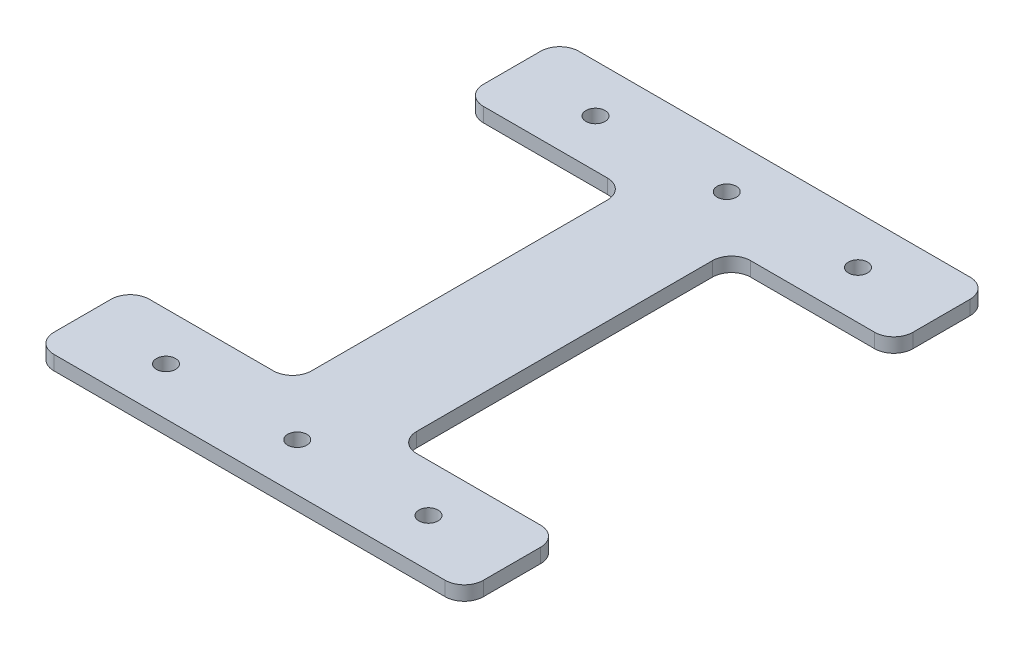
ISO-10303-21;
HEADER;
FILE_DESCRIPTION(('STEP AP214'),'2;1');
FILE_NAME('part.step','',(''),(''),'','','');
FILE_SCHEMA(('AUTOMOTIVE_DESIGN { 1 0 10303 214 1 1 1 1 }'));
ENDSEC;
DATA;
#1=APPLICATION_CONTEXT('core data for automotive mechanical design processes');
#2=APPLICATION_PROTOCOL_DEFINITION('international standard','automotive_design',2000,#1);
#3=PRODUCT_CONTEXT('',#1,'mechanical');
#4=PRODUCT('Part','Part','',(#3));
#5=PRODUCT_RELATED_PRODUCT_CATEGORY('part','',(#4));
#6=PRODUCT_DEFINITION_FORMATION('','',#4);
#7=PRODUCT_DEFINITION_CONTEXT('part definition',#1,'design');
#8=PRODUCT_DEFINITION('design','',#6,#7);
#9=PRODUCT_DEFINITION_SHAPE('','',#8);
#10=(LENGTH_UNIT() NAMED_UNIT(*) SI_UNIT(.MILLI.,.METRE.));
#11=(NAMED_UNIT(*) PLANE_ANGLE_UNIT() SI_UNIT($,.RADIAN.));
#12=(NAMED_UNIT(*) SI_UNIT($,.STERADIAN.) SOLID_ANGLE_UNIT());
#13=UNCERTAINTY_MEASURE_WITH_UNIT(LENGTH_MEASURE(1.E-05),#10,'distance_accuracy_value','');
#14=(GEOMETRIC_REPRESENTATION_CONTEXT(3) GLOBAL_UNCERTAINTY_ASSIGNED_CONTEXT((#13)) GLOBAL_UNIT_ASSIGNED_CONTEXT((#10,
#11,#12)) REPRESENTATION_CONTEXT('',''));
#15=CARTESIAN_POINT('',(0.,0.,0.));
#16=DIRECTION('',(0.,0.,1.));
#17=DIRECTION('',(1.,0.,0.));
#18=AXIS2_PLACEMENT_3D('',#15,#16,#17);
#19=CARTESIAN_POINT('',(11.,3.,0.));
#20=DIRECTION('',(1.,0.,0.));
#21=DIRECTION('',(0.,0.,-1.));
#22=AXIS2_PLACEMENT_3D('',#19,#20,#21);
#23=PLANE('',#22);
#24=DIRECTION('',(0.,0.,1.));
#25=VECTOR('',#24,1.);
#26=CARTESIAN_POINT('',(11.,3.,0.));
#27=LINE('',#26,#25);
#28=CARTESIAN_POINT('',(11.,3.,-31.));
#29=VERTEX_POINT('',#28);
#30=CARTESIAN_POINT('',(11.,3.,31.));
#31=VERTEX_POINT('',#30);
#32=EDGE_CURVE('E254',#29,#31,#27,.T.);
#33=ORIENTED_EDGE('',*,*,#32,.T.);
#34=DIRECTION('',(0.,-1.,0.));
#35=VECTOR('',#34,1.);
#36=CARTESIAN_POINT('',(11.,0.,31.));
#37=LINE('',#36,#35);
#38=CARTESIAN_POINT('',(11.,0.,31.));
#39=VERTEX_POINT('',#38);
#40=EDGE_CURVE('E289',#31,#39,#37,.T.);
#41=ORIENTED_EDGE('',*,*,#40,.T.);
#42=DIRECTION('',(0.,0.,1.));
#43=VECTOR('',#42,1.);
#44=CARTESIAN_POINT('',(11.,0.,0.));
#45=LINE('',#44,#43);
#46=CARTESIAN_POINT('',(11.,0.,-31.));
#47=VERTEX_POINT('',#46);
#48=EDGE_CURVE('E350',#47,#39,#45,.T.);
#49=ORIENTED_EDGE('',*,*,#48,.F.);
#50=DIRECTION('',(0.,-1.,0.));
#51=VECTOR('',#50,1.);
#52=CARTESIAN_POINT('',(11.,3.,-31.));
#53=LINE('',#52,#51);
#54=EDGE_CURVE('E287',#47,#29,#53,.F.);
#55=ORIENTED_EDGE('',*,*,#54,.T.);
#56=EDGE_LOOP('',(#33,#41,#49,#55));
#57=FACE_BOUND('',#56,.T.);
#58=ADVANCED_FACE('F39',(#57),#23,.T.);
#59=CARTESIAN_POINT('',(0.,3.,-35.));
#60=DIRECTION('',(0.,0.,-1.));
#61=DIRECTION('',(-1.,0.,0.));
#62=AXIS2_PLACEMENT_3D('',#59,#60,#61);
#63=PLANE('',#62);
#64=DIRECTION('',(1.,0.,0.));
#65=VECTOR('',#64,1.);
#66=CARTESIAN_POINT('',(0.,3.,-35.));
#67=LINE('',#66,#65);
#68=CARTESIAN_POINT('',(15.,3.,-35.));
#69=VERTEX_POINT('',#68);
#70=CARTESIAN_POINT('',(41.,3.,-35.));
#71=VERTEX_POINT('',#70);
#72=EDGE_CURVE('E368',#69,#71,#67,.T.);
#73=ORIENTED_EDGE('',*,*,#72,.F.);
#74=DIRECTION('',(0.,-1.,0.));
#75=VECTOR('',#74,1.);
#76=CARTESIAN_POINT('',(15.,3.,-35.));
#77=LINE('',#76,#75);
#78=CARTESIAN_POINT('',(15.,0.,-35.));
#79=VERTEX_POINT('',#78);
#80=EDGE_CURVE('E318',#69,#79,#77,.T.);
#81=ORIENTED_EDGE('',*,*,#80,.T.);
#82=DIRECTION('',(1.,0.,0.));
#83=VECTOR('',#82,1.);
#84=CARTESIAN_POINT('',(0.,0.,-35.));
#85=LINE('',#84,#83);
#86=CARTESIAN_POINT('',(41.,0.,-35.));
#87=VERTEX_POINT('',#86);
#88=EDGE_CURVE('E352',#79,#87,#85,.T.);
#89=ORIENTED_EDGE('',*,*,#88,.T.);
#90=DIRECTION('',(0.,-1.,0.));
#91=VECTOR('',#90,1.);
#92=CARTESIAN_POINT('',(41.,3.,-35.));
#93=LINE('',#92,#91);
#94=EDGE_CURVE('E316',#87,#71,#93,.F.);
#95=ORIENTED_EDGE('',*,*,#94,.T.);
#96=EDGE_LOOP('',(#73,#81,#89,#95));
#97=FACE_BOUND('',#96,.T.);
#98=ADVANCED_FACE('F371',(#97),#63,.F.);
#99=CARTESIAN_POINT('',(45.,3.,0.));
#100=DIRECTION('',(1.,0.,0.));
#101=DIRECTION('',(0.,0.,-1.));
#102=AXIS2_PLACEMENT_3D('',#99,#100,#101);
#103=PLANE('',#102);
#104=DIRECTION('',(0.,0.,1.));
#105=VECTOR('',#104,1.);
#106=CARTESIAN_POINT('',(45.,3.,0.));
#107=LINE('',#106,#105);
#108=CARTESIAN_POINT('',(45.,3.,-51.));
#109=VERTEX_POINT('',#108);
#110=CARTESIAN_POINT('',(45.,3.,-39.));
#111=VERTEX_POINT('',#110);
#112=EDGE_CURVE('E373',#109,#111,#107,.T.);
#113=ORIENTED_EDGE('',*,*,#112,.T.);
#114=DIRECTION('',(0.,-1.,0.));
#115=VECTOR('',#114,1.);
#116=CARTESIAN_POINT('',(45.,0.,-39.));
#117=LINE('',#116,#115);
#118=CARTESIAN_POINT('',(45.,0.,-39.));
#119=VERTEX_POINT('',#118);
#120=EDGE_CURVE('E323',#111,#119,#117,.T.);
#121=ORIENTED_EDGE('',*,*,#120,.T.);
#122=DIRECTION('',(0.,0.,1.));
#123=VECTOR('',#122,1.);
#124=CARTESIAN_POINT('',(45.,0.,0.));
#125=LINE('',#124,#123);
#126=CARTESIAN_POINT('',(45.,0.,-51.));
#127=VERTEX_POINT('',#126);
#128=EDGE_CURVE('E421',#127,#119,#125,.T.);
#129=ORIENTED_EDGE('',*,*,#128,.F.);
#130=DIRECTION('',(0.,-1.,0.));
#131=VECTOR('',#130,1.);
#132=CARTESIAN_POINT('',(45.,3.,-51.));
#133=LINE('',#132,#131);
#134=EDGE_CURVE('E321',#127,#109,#133,.F.);
#135=ORIENTED_EDGE('',*,*,#134,.T.);
#136=EDGE_LOOP('',(#113,#121,#129,#135));
#137=FACE_BOUND('',#136,.T.);
#138=ADVANCED_FACE('F464',(#137),#103,.T.);
#139=CARTESIAN_POINT('',(0.,3.,-55.));
#140=DIRECTION('',(0.,0.,-1.));
#141=DIRECTION('',(-1.,0.,0.));
#142=AXIS2_PLACEMENT_3D('',#139,#140,#141);
#143=PLANE('',#142);
#144=DIRECTION('',(1.,0.,0.));
#145=VECTOR('',#144,1.);
#146=CARTESIAN_POINT('',(0.,3.,-55.));
#147=LINE('',#146,#145);
#148=CARTESIAN_POINT('',(-41.,3.,-55.));
#149=VERTEX_POINT('',#148);
#150=CARTESIAN_POINT('',(41.,3.,-55.));
#151=VERTEX_POINT('',#150);
#152=EDGE_CURVE('E377',#149,#151,#147,.T.);
#153=ORIENTED_EDGE('',*,*,#152,.T.);
#154=DIRECTION('',(0.,-1.,0.));
#155=VECTOR('',#154,1.);
#156=CARTESIAN_POINT('',(41.,3.,-55.));
#157=LINE('',#156,#155);
#158=CARTESIAN_POINT('',(41.,0.,-55.));
#159=VERTEX_POINT('',#158);
#160=EDGE_CURVE('E328',#151,#159,#157,.T.);
#161=ORIENTED_EDGE('',*,*,#160,.T.);
#162=DIRECTION('',(1.,0.,0.));
#163=VECTOR('',#162,1.);
#164=CARTESIAN_POINT('',(0.,0.,-55.));
#165=LINE('',#164,#163);
#166=CARTESIAN_POINT('',(-41.,0.,-55.));
#167=VERTEX_POINT('',#166);
#168=EDGE_CURVE('E425',#167,#159,#165,.T.);
#169=ORIENTED_EDGE('',*,*,#168,.F.);
#170=DIRECTION('',(0.,-1.,0.));
#171=VECTOR('',#170,1.);
#172=CARTESIAN_POINT('',(-41.,3.,-55.));
#173=LINE('',#172,#171);
#174=EDGE_CURVE('E326',#167,#149,#173,.F.);
#175=ORIENTED_EDGE('',*,*,#174,.T.);
#176=EDGE_LOOP('',(#153,#161,#169,#175));
#177=FACE_BOUND('',#176,.T.);
#178=ADVANCED_FACE('F538',(#177),#143,.T.);
#179=CARTESIAN_POINT('',(-45.,3.,0.));
#180=DIRECTION('',(1.,0.,0.));
#181=DIRECTION('',(0.,0.,-1.));
#182=AXIS2_PLACEMENT_3D('',#179,#180,#181);
#183=PLANE('',#182);
#184=DIRECTION('',(0.,0.,1.));
#185=VECTOR('',#184,1.);
#186=CARTESIAN_POINT('',(-45.,3.,0.));
#187=LINE('',#186,#185);
#188=CARTESIAN_POINT('',(-45.,3.,-51.));
#189=VERTEX_POINT('',#188);
#190=CARTESIAN_POINT('',(-45.,3.,-39.));
#191=VERTEX_POINT('',#190);
#192=EDGE_CURVE('E382',#189,#191,#187,.T.);
#193=ORIENTED_EDGE('',*,*,#192,.F.);
#194=DIRECTION('',(0.,-1.,0.));
#195=VECTOR('',#194,1.);
#196=CARTESIAN_POINT('',(-45.,0.,-51.));
#197=LINE('',#196,#195);
#198=CARTESIAN_POINT('',(-45.,0.,-51.));
#199=VERTEX_POINT('',#198);
#200=EDGE_CURVE('E333',#189,#199,#197,.T.);
#201=ORIENTED_EDGE('',*,*,#200,.T.);
#202=DIRECTION('',(0.,0.,1.));
#203=VECTOR('',#202,1.);
#204=CARTESIAN_POINT('',(-45.,0.,0.));
#205=LINE('',#204,#203);
#206=CARTESIAN_POINT('',(-45.,0.,-39.));
#207=VERTEX_POINT('',#206);
#208=EDGE_CURVE('E428',#199,#207,#205,.T.);
#209=ORIENTED_EDGE('',*,*,#208,.T.);
#210=DIRECTION('',(0.,-1.,0.));
#211=VECTOR('',#210,1.);
#212=CARTESIAN_POINT('',(-45.,3.,-39.));
#213=LINE('',#212,#211);
#214=EDGE_CURVE('E331',#207,#191,#213,.F.);
#215=ORIENTED_EDGE('',*,*,#214,.T.);
#216=EDGE_LOOP('',(#193,#201,#209,#215));
#217=FACE_BOUND('',#216,.T.);
#218=ADVANCED_FACE('F515',(#217),#183,.F.);
#219=CARTESIAN_POINT('',(-41.,0.,-35.));
#220=VERTEX_POINT('',#219);
#221=CARTESIAN_POINT('',(-15.,0.,-35.));
#222=VERTEX_POINT('',#221);
#223=EDGE_CURVE('E422',#220,#222,#85,.T.);
#224=ORIENTED_EDGE('',*,*,#223,.T.);
#225=DIRECTION('',(0.,-1.,0.));
#226=VECTOR('',#225,1.);
#227=CARTESIAN_POINT('',(-15.,3.,-35.));
#228=LINE('',#227,#226);
#229=CARTESIAN_POINT('',(-15.,3.,-35.));
#230=VERTEX_POINT('',#229);
#231=EDGE_CURVE('E314',#222,#230,#228,.F.);
#232=ORIENTED_EDGE('',*,*,#231,.T.);
#233=CARTESIAN_POINT('',(-41.,3.,-35.));
#234=VERTEX_POINT('',#233);
#235=EDGE_CURVE('E375',#234,#230,#67,.T.);
#236=ORIENTED_EDGE('',*,*,#235,.F.);
#237=DIRECTION('',(0.,-1.,0.));
#238=VECTOR('',#237,1.);
#239=CARTESIAN_POINT('',(-41.,3.,-35.));
#240=LINE('',#239,#238);
#241=EDGE_CURVE('E311',#234,#220,#240,.T.);
#242=ORIENTED_EDGE('',*,*,#241,.T.);
#243=EDGE_LOOP('',(#224,#232,#236,#242));
#244=FACE_BOUND('',#243,.T.);
#245=ADVANCED_FACE('F466',(#244),#63,.F.);
#246=CARTESIAN_POINT('',(-11.,3.,0.));
#247=DIRECTION('',(1.,0.,0.));
#248=DIRECTION('',(0.,0.,-1.));
#249=AXIS2_PLACEMENT_3D('',#246,#247,#248);
#250=PLANE('',#249);
#251=DIRECTION('',(0.,0.,1.));
#252=VECTOR('',#251,1.);
#253=CARTESIAN_POINT('',(-11.,0.,0.));
#254=LINE('',#253,#252);
#255=CARTESIAN_POINT('',(-11.,0.,-31.));
#256=VERTEX_POINT('',#255);
#257=CARTESIAN_POINT('',(-11.,0.,31.));
#258=VERTEX_POINT('',#257);
#259=EDGE_CURVE('E431',#256,#258,#254,.T.);
#260=ORIENTED_EDGE('',*,*,#259,.T.);
#261=DIRECTION('',(0.,-1.,0.));
#262=VECTOR('',#261,1.);
#263=CARTESIAN_POINT('',(-11.,3.,31.));
#264=LINE('',#263,#262);
#265=CARTESIAN_POINT('',(-11.,3.,31.));
#266=VERTEX_POINT('',#265);
#267=EDGE_CURVE('E309',#258,#266,#264,.F.);
#268=ORIENTED_EDGE('',*,*,#267,.T.);
#269=DIRECTION('',(0.,0.,1.));
#270=VECTOR('',#269,1.);
#271=CARTESIAN_POINT('',(-11.,3.,0.));
#272=LINE('',#271,#270);
#273=CARTESIAN_POINT('',(-11.,3.,-31.));
#274=VERTEX_POINT('',#273);
#275=EDGE_CURVE('E381',#274,#266,#272,.T.);
#276=ORIENTED_EDGE('',*,*,#275,.F.);
#277=DIRECTION('',(0.,-1.,0.));
#278=VECTOR('',#277,1.);
#279=CARTESIAN_POINT('',(-11.,0.,-31.));
#280=LINE('',#279,#278);
#281=EDGE_CURVE('E306',#274,#256,#280,.T.);
#282=ORIENTED_EDGE('',*,*,#281,.T.);
#283=EDGE_LOOP('',(#260,#268,#276,#282));
#284=FACE_BOUND('',#283,.T.);
#285=ADVANCED_FACE('F527',(#284),#250,.F.);
#286=CARTESIAN_POINT('',(0.,3.,35.));
#287=DIRECTION('',(0.,0.,-1.));
#288=DIRECTION('',(-1.,0.,0.));
#289=AXIS2_PLACEMENT_3D('',#286,#287,#288);
#290=PLANE('',#289);
#291=DIRECTION('',(1.,0.,0.));
#292=VECTOR('',#291,1.);
#293=CARTESIAN_POINT('',(0.,0.,35.));
#294=LINE('',#293,#292);
#295=CARTESIAN_POINT('',(-41.,0.,35.));
#296=VERTEX_POINT('',#295);
#297=CARTESIAN_POINT('',(-15.,0.,35.));
#298=VERTEX_POINT('',#297);
#299=EDGE_CURVE('E232',#296,#298,#294,.T.);
#300=ORIENTED_EDGE('',*,*,#299,.F.);
#301=DIRECTION('',(0.,-1.,0.));
#302=VECTOR('',#301,1.);
#303=CARTESIAN_POINT('',(-41.,3.,35.));
#304=LINE('',#303,#302);
#305=CARTESIAN_POINT('',(-41.,3.,35.));
#306=VERTEX_POINT('',#305);
#307=EDGE_CURVE('E304',#296,#306,#304,.F.);
#308=ORIENTED_EDGE('',*,*,#307,.T.);
#309=DIRECTION('',(1.,0.,0.));
#310=VECTOR('',#309,1.);
#311=CARTESIAN_POINT('',(0.,3.,35.));
#312=LINE('',#311,#310);
#313=CARTESIAN_POINT('',(-15.,3.,35.));
#314=VERTEX_POINT('',#313);
#315=EDGE_CURVE('E386',#306,#314,#312,.T.);
#316=ORIENTED_EDGE('',*,*,#315,.T.);
#317=DIRECTION('',(0.,-1.,0.));
#318=VECTOR('',#317,1.);
#319=CARTESIAN_POINT('',(-15.,3.,35.));
#320=LINE('',#319,#318);
#321=EDGE_CURVE('E301',#314,#298,#320,.T.);
#322=ORIENTED_EDGE('',*,*,#321,.T.);
#323=EDGE_LOOP('',(#300,#308,#316,#322));
#324=FACE_BOUND('',#323,.T.);
#325=ADVANCED_FACE('F457',(#324),#290,.T.);
#326=CARTESIAN_POINT('',(-45.,3.,0.));
#327=DIRECTION('',(-1.,0.,0.));
#328=DIRECTION('',(0.,0.,1.));
#329=AXIS2_PLACEMENT_3D('',#326,#327,#328);
#330=PLANE('',#329);
#331=DIRECTION('',(0.,0.,-1.));
#332=VECTOR('',#331,1.);
#333=CARTESIAN_POINT('',(-45.,0.,0.));
#334=LINE('',#333,#332);
#335=CARTESIAN_POINT('',(-45.,0.,51.));
#336=VERTEX_POINT('',#335);
#337=CARTESIAN_POINT('',(-45.,0.,39.));
#338=VERTEX_POINT('',#337);
#339=EDGE_CURVE('E233',#336,#338,#334,.T.);
#340=ORIENTED_EDGE('',*,*,#339,.F.);
#341=DIRECTION('',(0.,-1.,0.));
#342=VECTOR('',#341,1.);
#343=CARTESIAN_POINT('',(-45.,3.,51.));
#344=LINE('',#343,#342);
#345=CARTESIAN_POINT('',(-45.,3.,51.));
#346=VERTEX_POINT('',#345);
#347=EDGE_CURVE('E299',#336,#346,#344,.F.);
#348=ORIENTED_EDGE('',*,*,#347,.T.);
#349=DIRECTION('',(0.,0.,-1.));
#350=VECTOR('',#349,1.);
#351=CARTESIAN_POINT('',(-45.,3.,0.));
#352=LINE('',#351,#350);
#353=CARTESIAN_POINT('',(-45.,3.,39.));
#354=VERTEX_POINT('',#353);
#355=EDGE_CURVE('E398',#346,#354,#352,.T.);
#356=ORIENTED_EDGE('',*,*,#355,.T.);
#357=DIRECTION('',(0.,-1.,0.));
#358=VECTOR('',#357,1.);
#359=CARTESIAN_POINT('',(-45.,3.,39.));
#360=LINE('',#359,#358);
#361=EDGE_CURVE('E296',#354,#338,#360,.T.);
#362=ORIENTED_EDGE('',*,*,#361,.T.);
#363=EDGE_LOOP('',(#340,#348,#356,#362));
#364=FACE_BOUND('',#363,.T.);
#365=ADVANCED_FACE('F439',(#364),#330,.T.);
#366=CARTESIAN_POINT('',(0.,3.,55.));
#367=DIRECTION('',(0.,0.,-1.));
#368=DIRECTION('',(-1.,0.,0.));
#369=AXIS2_PLACEMENT_3D('',#366,#367,#368);
#370=PLANE('',#369);
#371=DIRECTION('',(1.,0.,0.));
#372=VECTOR('',#371,1.);
#373=CARTESIAN_POINT('',(0.,0.,55.));
#374=LINE('',#373,#372);
#375=CARTESIAN_POINT('',(-41.,0.,55.));
#376=VERTEX_POINT('',#375);
#377=CARTESIAN_POINT('',(41.,0.,55.));
#378=VERTEX_POINT('',#377);
#379=EDGE_CURVE('E228',#376,#378,#374,.T.);
#380=ORIENTED_EDGE('',*,*,#379,.T.);
#381=DIRECTION('',(0.,-1.,0.));
#382=VECTOR('',#381,1.);
#383=CARTESIAN_POINT('',(41.,3.,55.));
#384=LINE('',#383,#382);
#385=CARTESIAN_POINT('',(41.,3.,55.));
#386=VERTEX_POINT('',#385);
#387=EDGE_CURVE('E206',#378,#386,#384,.F.);
#388=ORIENTED_EDGE('',*,*,#387,.T.);
#389=DIRECTION('',(1.,0.,0.));
#390=VECTOR('',#389,1.);
#391=CARTESIAN_POINT('',(0.,3.,55.));
#392=LINE('',#391,#390);
#393=CARTESIAN_POINT('',(-41.,3.,55.));
#394=VERTEX_POINT('',#393);
#395=EDGE_CURVE('E401',#394,#386,#392,.T.);
#396=ORIENTED_EDGE('',*,*,#395,.F.);
#397=DIRECTION('',(0.,-1.,0.));
#398=VECTOR('',#397,1.);
#399=CARTESIAN_POINT('',(-41.,0.,55.));
#400=LINE('',#399,#398);
#401=EDGE_CURVE('E211',#394,#376,#400,.T.);
#402=ORIENTED_EDGE('',*,*,#401,.T.);
#403=EDGE_LOOP('',(#380,#388,#396,#402));
#404=FACE_BOUND('',#403,.T.);
#405=ADVANCED_FACE('F448',(#404),#370,.F.);
#406=CARTESIAN_POINT('',(45.,3.,0.));
#407=DIRECTION('',(-1.,0.,0.));
#408=DIRECTION('',(0.,0.,1.));
#409=AXIS2_PLACEMENT_3D('',#406,#407,#408);
#410=PLANE('',#409);
#411=DIRECTION('',(0.,0.,-1.));
#412=VECTOR('',#411,1.);
#413=CARTESIAN_POINT('',(45.,3.,0.));
#414=LINE('',#413,#412);
#415=CARTESIAN_POINT('',(45.,3.,51.));
#416=VERTEX_POINT('',#415);
#417=CARTESIAN_POINT('',(45.,3.,39.));
#418=VERTEX_POINT('',#417);
#419=EDGE_CURVE('E220',#416,#418,#414,.T.);
#420=ORIENTED_EDGE('',*,*,#419,.F.);
#421=DIRECTION('',(0.,-1.,0.));
#422=VECTOR('',#421,1.);
#423=CARTESIAN_POINT('',(45.,3.,51.));
#424=LINE('',#423,#422);
#425=CARTESIAN_POINT('',(45.,0.,51.));
#426=VERTEX_POINT('',#425);
#427=EDGE_CURVE('E205',#416,#426,#424,.T.);
#428=ORIENTED_EDGE('',*,*,#427,.T.);
#429=DIRECTION('',(0.,0.,-1.));
#430=VECTOR('',#429,1.);
#431=CARTESIAN_POINT('',(45.,0.,0.));
#432=LINE('',#431,#430);
#433=CARTESIAN_POINT('',(45.,0.,39.));
#434=VERTEX_POINT('',#433);
#435=EDGE_CURVE('E218',#426,#434,#432,.T.);
#436=ORIENTED_EDGE('',*,*,#435,.T.);
#437=DIRECTION('',(0.,-1.,0.));
#438=VECTOR('',#437,1.);
#439=CARTESIAN_POINT('',(45.,3.,39.));
#440=LINE('',#439,#438);
#441=EDGE_CURVE('E222',#434,#418,#440,.F.);
#442=ORIENTED_EDGE('',*,*,#441,.T.);
#443=EDGE_LOOP('',(#420,#428,#436,#442));
#444=FACE_BOUND('',#443,.T.);
#445=ADVANCED_FACE('F217',(#444),#410,.F.);
#446=CARTESIAN_POINT('',(-27.5,3.,-45.));
#447=DIRECTION('',(0.,-1.,0.));
#448=DIRECTION('',(0.,0.,-1.));
#449=AXIS2_PLACEMENT_3D('',#446,#447,#448);
#450=CYLINDRICAL_SURFACE('',#449,2.);
#451=CARTESIAN_POINT('',(-27.5,3.,-45.));
#452=DIRECTION('',(0.,1.,0.));
#453=DIRECTION('',(0.,0.,1.));
#454=AXIS2_PLACEMENT_3D('',#451,#452,#453);
#455=CIRCLE('',#454,2.);
#456=CARTESIAN_POINT('',(-27.5,3.,-43.));
#457=VERTEX_POINT('',#456);
#458=EDGE_CURVE('E415',#457,#457,#455,.T.);
#459=ORIENTED_EDGE('',*,*,#458,.T.);
#460=EDGE_LOOP('',(#459));
#461=FACE_BOUND('',#460,.T.);
#462=CARTESIAN_POINT('',(-27.5,0.,-45.));
#463=DIRECTION('',(0.,1.,0.));
#464=DIRECTION('',(0.,0.,1.));
#465=AXIS2_PLACEMENT_3D('',#462,#463,#464);
#466=CIRCLE('',#465,2.);
#467=CARTESIAN_POINT('',(-27.5,0.,-43.));
#468=VERTEX_POINT('',#467);
#469=EDGE_CURVE('E248',#468,#468,#466,.T.);
#470=ORIENTED_EDGE('',*,*,#469,.F.);
#471=EDGE_LOOP('',(#470));
#472=FACE_BOUND('',#471,.T.);
#473=ADVANCED_FACE('F455',(#461,#472),#450,.F.);
#474=CARTESIAN_POINT('',(0.,3.,-45.));
#475=DIRECTION('',(0.,-1.,0.));
#476=DIRECTION('',(0.,0.,-1.));
#477=AXIS2_PLACEMENT_3D('',#474,#475,#476);
#478=CYLINDRICAL_SURFACE('',#477,2.);
#479=CARTESIAN_POINT('',(0.,3.,-45.));
#480=DIRECTION('',(0.,1.,0.));
#481=DIRECTION('',(0.,0.,1.));
#482=AXIS2_PLACEMENT_3D('',#479,#480,#481);
#483=CIRCLE('',#482,2.);
#484=CARTESIAN_POINT('',(0.,3.,-43.));
#485=VERTEX_POINT('',#484);
#486=EDGE_CURVE('E412',#485,#485,#483,.T.);
#487=ORIENTED_EDGE('',*,*,#486,.T.);
#488=EDGE_LOOP('',(#487));
#489=FACE_BOUND('',#488,.T.);
#490=CARTESIAN_POINT('',(0.,0.,-45.));
#491=DIRECTION('',(0.,1.,0.));
#492=DIRECTION('',(0.,0.,1.));
#493=AXIS2_PLACEMENT_3D('',#490,#491,#492);
#494=CIRCLE('',#493,2.);
#495=CARTESIAN_POINT('',(0.,0.,-43.));
#496=VERTEX_POINT('',#495);
#497=EDGE_CURVE('E245',#496,#496,#494,.T.);
#498=ORIENTED_EDGE('',*,*,#497,.F.);
#499=EDGE_LOOP('',(#498));
#500=FACE_BOUND('',#499,.T.);
#501=ADVANCED_FACE('F589',(#489,#500),#478,.F.);
#502=CARTESIAN_POINT('',(-27.5,3.,45.));
#503=DIRECTION('',(0.,-1.,0.));
#504=DIRECTION('',(0.,0.,-1.));
#505=AXIS2_PLACEMENT_3D('',#502,#503,#504);
#506=CYLINDRICAL_SURFACE('',#505,2.);
#507=CARTESIAN_POINT('',(-27.5,3.,45.));
#508=DIRECTION('',(0.,1.,0.));
#509=DIRECTION('',(0.,0.,1.));
#510=AXIS2_PLACEMENT_3D('',#507,#508,#509);
#511=CIRCLE('',#510,2.);
#512=CARTESIAN_POINT('',(-27.5,3.,47.));
#513=VERTEX_POINT('',#512);
#514=EDGE_CURVE('E409',#513,#513,#511,.F.);
#515=ORIENTED_EDGE('',*,*,#514,.F.);
#516=EDGE_LOOP('',(#515));
#517=FACE_BOUND('',#516,.T.);
#518=CARTESIAN_POINT('',(-27.5,0.,45.));
#519=DIRECTION('',(0.,1.,0.));
#520=DIRECTION('',(0.,0.,1.));
#521=AXIS2_PLACEMENT_3D('',#518,#519,#520);
#522=CIRCLE('',#521,2.);
#523=CARTESIAN_POINT('',(-27.5,0.,47.));
#524=VERTEX_POINT('',#523);
#525=EDGE_CURVE('E242',#524,#524,#522,.F.);
#526=ORIENTED_EDGE('',*,*,#525,.T.);
#527=EDGE_LOOP('',(#526));
#528=FACE_BOUND('',#527,.T.);
#529=ADVANCED_FACE('F581',(#517,#528),#506,.F.);
#530=CARTESIAN_POINT('',(27.5,3.,45.));
#531=DIRECTION('',(0.,-1.,0.));
#532=DIRECTION('',(0.,0.,-1.));
#533=AXIS2_PLACEMENT_3D('',#530,#531,#532);
#534=CYLINDRICAL_SURFACE('',#533,2.);
#535=CARTESIAN_POINT('',(27.5,3.,45.));
#536=DIRECTION('',(0.,1.,0.));
#537=DIRECTION('',(0.,0.,1.));
#538=AXIS2_PLACEMENT_3D('',#535,#536,#537);
#539=CIRCLE('',#538,2.);
#540=CARTESIAN_POINT('',(27.5,3.,47.));
#541=VERTEX_POINT('',#540);
#542=EDGE_CURVE('E406',#541,#541,#539,.T.);
#543=ORIENTED_EDGE('',*,*,#542,.T.);
#544=EDGE_LOOP('',(#543));
#545=FACE_BOUND('',#544,.T.);
#546=CARTESIAN_POINT('',(27.5,0.,45.));
#547=DIRECTION('',(0.,1.,0.));
#548=DIRECTION('',(0.,0.,1.));
#549=AXIS2_PLACEMENT_3D('',#546,#547,#548);
#550=CIRCLE('',#549,2.);
#551=CARTESIAN_POINT('',(27.5,0.,47.));
#552=VERTEX_POINT('',#551);
#553=EDGE_CURVE('E239',#552,#552,#550,.T.);
#554=ORIENTED_EDGE('',*,*,#553,.F.);
#555=EDGE_LOOP('',(#554));
#556=FACE_BOUND('',#555,.T.);
#557=ADVANCED_FACE('F574',(#545,#556),#534,.F.);
#558=CARTESIAN_POINT('',(0.,3.,45.));
#559=DIRECTION('',(0.,-1.,0.));
#560=DIRECTION('',(0.,0.,-1.));
#561=AXIS2_PLACEMENT_3D('',#558,#559,#560);
#562=CYLINDRICAL_SURFACE('',#561,2.);
#563=CARTESIAN_POINT('',(0.,3.,45.));
#564=DIRECTION('',(0.,1.,0.));
#565=DIRECTION('',(0.,0.,1.));
#566=AXIS2_PLACEMENT_3D('',#563,#564,#565);
#567=CIRCLE('',#566,2.);
#568=CARTESIAN_POINT('',(0.,3.,47.));
#569=VERTEX_POINT('',#568);
#570=EDGE_CURVE('E397',#569,#569,#567,.F.);
#571=ORIENTED_EDGE('',*,*,#570,.F.);
#572=EDGE_LOOP('',(#571));
#573=FACE_BOUND('',#572,.T.);
#574=CARTESIAN_POINT('',(0.,0.,45.));
#575=DIRECTION('',(0.,1.,0.));
#576=DIRECTION('',(0.,0.,1.));
#577=AXIS2_PLACEMENT_3D('',#574,#575,#576);
#578=CIRCLE('',#577,2.);
#579=CARTESIAN_POINT('',(0.,0.,47.));
#580=VERTEX_POINT('',#579);
#581=EDGE_CURVE('E230',#580,#580,#578,.F.);
#582=ORIENTED_EDGE('',*,*,#581,.T.);
#583=EDGE_LOOP('',(#582));
#584=FACE_BOUND('',#583,.T.);
#585=ADVANCED_FACE('F567',(#573,#584),#562,.F.);
#586=CARTESIAN_POINT('',(15.,0.,35.));
#587=VERTEX_POINT('',#586);
#588=CARTESIAN_POINT('',(41.,0.,35.));
#589=VERTEX_POINT('',#588);
#590=EDGE_CURVE('E227',#587,#589,#294,.T.);
#591=ORIENTED_EDGE('',*,*,#590,.F.);
#592=DIRECTION('',(0.,-1.,0.));
#593=VECTOR('',#592,1.);
#594=CARTESIAN_POINT('',(15.,3.,35.));
#595=LINE('',#594,#593);
#596=CARTESIAN_POINT('',(15.,3.,35.));
#597=VERTEX_POINT('',#596);
#598=EDGE_CURVE('E61',#587,#597,#595,.F.);
#599=ORIENTED_EDGE('',*,*,#598,.T.);
#600=CARTESIAN_POINT('',(41.,3.,35.));
#601=VERTEX_POINT('',#600);
#602=EDGE_CURVE('E395',#597,#601,#312,.T.);
#603=ORIENTED_EDGE('',*,*,#602,.T.);
#604=DIRECTION('',(0.,-1.,0.));
#605=VECTOR('',#604,1.);
#606=CARTESIAN_POINT('',(41.,0.,35.));
#607=LINE('',#606,#605);
#608=EDGE_CURVE('E292',#601,#589,#607,.T.);
#609=ORIENTED_EDGE('',*,*,#608,.T.);
#610=EDGE_LOOP('',(#591,#599,#603,#609));
#611=FACE_BOUND('',#610,.T.);
#612=ADVANCED_FACE('F561',(#611),#290,.T.);
#613=CARTESIAN_POINT('',(27.5,3.,-45.));
#614=DIRECTION('',(0.,-1.,0.));
#615=DIRECTION('',(0.,0.,-1.));
#616=AXIS2_PLACEMENT_3D('',#613,#614,#615);
#617=CYLINDRICAL_SURFACE('',#616,2.);
#618=CARTESIAN_POINT('',(27.5,3.,-45.));
#619=DIRECTION('',(0.,1.,0.));
#620=DIRECTION('',(0.,0.,1.));
#621=AXIS2_PLACEMENT_3D('',#618,#619,#620);
#622=CIRCLE('',#621,2.);
#623=CARTESIAN_POINT('',(27.5,3.,-43.));
#624=VERTEX_POINT('',#623);
#625=EDGE_CURVE('E255',#624,#624,#622,.F.);
#626=ORIENTED_EDGE('',*,*,#625,.F.);
#627=EDGE_LOOP('',(#626));
#628=FACE_BOUND('',#627,.T.);
#629=CARTESIAN_POINT('',(27.5,0.,-45.));
#630=DIRECTION('',(0.,1.,0.));
#631=DIRECTION('',(0.,0.,1.));
#632=AXIS2_PLACEMENT_3D('',#629,#630,#631);
#633=CIRCLE('',#632,2.);
#634=CARTESIAN_POINT('',(27.5,0.,-43.));
#635=VERTEX_POINT('',#634);
#636=EDGE_CURVE('E251',#635,#635,#633,.F.);
#637=ORIENTED_EDGE('',*,*,#636,.T.);
#638=EDGE_LOOP('',(#637));
#639=FACE_BOUND('',#638,.T.);
#640=ADVANCED_FACE('F566',(#628,#639),#617,.F.);
#641=CARTESIAN_POINT('',(0.,3.,0.));
#642=DIRECTION('',(0.,1.,0.));
#643=DIRECTION('',(0.,0.,1.));
#644=AXIS2_PLACEMENT_3D('',#641,#642,#643);
#645=PLANE('',#644);
#646=ORIENTED_EDGE('',*,*,#395,.T.);
#647=CARTESIAN_POINT('',(41.,3.,51.));
#648=DIRECTION('',(0.,1.,0.));
#649=DIRECTION('',(0.,0.,1.));
#650=AXIS2_PLACEMENT_3D('',#647,#648,#649);
#651=CIRCLE('',#650,4.);
#652=EDGE_CURVE('E285',#386,#416,#651,.T.);
#653=ORIENTED_EDGE('',*,*,#652,.T.);
#654=ORIENTED_EDGE('',*,*,#419,.T.);
#655=CARTESIAN_POINT('',(41.,3.,39.));
#656=DIRECTION('',(0.,1.,0.));
#657=DIRECTION('',(0.,0.,1.));
#658=AXIS2_PLACEMENT_3D('',#655,#656,#657);
#659=CIRCLE('',#658,4.);
#660=EDGE_CURVE('E54',#418,#601,#659,.T.);
#661=ORIENTED_EDGE('',*,*,#660,.T.);
#662=ORIENTED_EDGE('',*,*,#602,.F.);
#663=CARTESIAN_POINT('',(15.,3.,31.));
#664=DIRECTION('',(0.,1.,0.));
#665=DIRECTION('',(0.,0.,1.));
#666=AXIS2_PLACEMENT_3D('',#663,#664,#665);
#667=CIRCLE('',#666,4.);
#668=EDGE_CURVE('E338',#597,#31,#667,.F.);
#669=ORIENTED_EDGE('',*,*,#668,.T.);
#670=ORIENTED_EDGE('',*,*,#32,.F.);
#671=CARTESIAN_POINT('',(15.,3.,-31.));
#672=DIRECTION('',(0.,1.,0.));
#673=DIRECTION('',(0.,0.,1.));
#674=AXIS2_PLACEMENT_3D('',#671,#672,#673);
#675=CIRCLE('',#674,4.);
#676=EDGE_CURVE('E11',#29,#69,#675,.F.);
#677=ORIENTED_EDGE('',*,*,#676,.T.);
#678=ORIENTED_EDGE('',*,*,#72,.T.);
#679=CARTESIAN_POINT('',(41.,3.,-39.));
#680=DIRECTION('',(0.,1.,0.));
#681=DIRECTION('',(0.,0.,1.));
#682=AXIS2_PLACEMENT_3D('',#679,#680,#681);
#683=CIRCLE('',#682,4.);
#684=EDGE_CURVE('E278',#71,#111,#683,.T.);
#685=ORIENTED_EDGE('',*,*,#684,.T.);
#686=ORIENTED_EDGE('',*,*,#112,.F.);
#687=CARTESIAN_POINT('',(41.,3.,-51.));
#688=DIRECTION('',(0.,1.,0.));
#689=DIRECTION('',(0.,0.,1.));
#690=AXIS2_PLACEMENT_3D('',#687,#688,#689);
#691=CIRCLE('',#690,4.);
#692=EDGE_CURVE('E276',#109,#151,#691,.T.);
#693=ORIENTED_EDGE('',*,*,#692,.T.);
#694=ORIENTED_EDGE('',*,*,#152,.F.);
#695=CARTESIAN_POINT('',(-41.,3.,-51.));
#696=DIRECTION('',(0.,1.,0.));
#697=DIRECTION('',(0.,0.,1.));
#698=AXIS2_PLACEMENT_3D('',#695,#696,#697);
#699=CIRCLE('',#698,4.);
#700=EDGE_CURVE('E274',#149,#189,#699,.T.);
#701=ORIENTED_EDGE('',*,*,#700,.T.);
#702=ORIENTED_EDGE('',*,*,#192,.T.);
#703=CARTESIAN_POINT('',(-41.,3.,-39.));
#704=DIRECTION('',(0.,1.,0.));
#705=DIRECTION('',(0.,0.,1.));
#706=AXIS2_PLACEMENT_3D('',#703,#704,#705);
#707=CIRCLE('',#706,4.);
#708=EDGE_CURVE('E272',#191,#234,#707,.T.);
#709=ORIENTED_EDGE('',*,*,#708,.T.);
#710=ORIENTED_EDGE('',*,*,#235,.T.);
#711=CARTESIAN_POINT('',(-15.,3.,-31.));
#712=DIRECTION('',(0.,1.,0.));
#713=DIRECTION('',(0.,0.,1.));
#714=AXIS2_PLACEMENT_3D('',#711,#712,#713);
#715=CIRCLE('',#714,4.);
#716=EDGE_CURVE('E346',#230,#274,#715,.F.);
#717=ORIENTED_EDGE('',*,*,#716,.T.);
#718=ORIENTED_EDGE('',*,*,#275,.T.);
#719=CARTESIAN_POINT('',(-15.,3.,31.));
#720=DIRECTION('',(0.,1.,0.));
#721=DIRECTION('',(0.,0.,1.));
#722=AXIS2_PLACEMENT_3D('',#719,#720,#721);
#723=CIRCLE('',#722,4.);
#724=EDGE_CURVE('E342',#266,#314,#723,.F.);
#725=ORIENTED_EDGE('',*,*,#724,.T.);
#726=ORIENTED_EDGE('',*,*,#315,.F.);
#727=CARTESIAN_POINT('',(-41.,3.,39.));
#728=DIRECTION('',(0.,1.,0.));
#729=DIRECTION('',(0.,0.,1.));
#730=AXIS2_PLACEMENT_3D('',#727,#728,#729);
#731=CIRCLE('',#730,4.);
#732=EDGE_CURVE('E280',#306,#354,#731,.T.);
#733=ORIENTED_EDGE('',*,*,#732,.T.);
#734=ORIENTED_EDGE('',*,*,#355,.F.);
#735=CARTESIAN_POINT('',(-41.,3.,51.));
#736=DIRECTION('',(0.,1.,0.));
#737=DIRECTION('',(0.,0.,1.));
#738=AXIS2_PLACEMENT_3D('',#735,#736,#737);
#739=CIRCLE('',#738,4.);
#740=EDGE_CURVE('E282',#346,#394,#739,.T.);
#741=ORIENTED_EDGE('',*,*,#740,.T.);
#742=EDGE_LOOP('',(#646,#653,#654,#661,#662,#669,#670,#677,#678,#685,#686,#693,#694,#701,#702,
#709,#710,#717,#718,#725,#726,#733,#734,#741));
#743=FACE_BOUND('',#742,.T.);
#744=ORIENTED_EDGE('',*,*,#570,.T.);
#745=EDGE_LOOP('',(#744));
#746=FACE_BOUND('',#745,.T.);
#747=ORIENTED_EDGE('',*,*,#542,.F.);
#748=EDGE_LOOP('',(#747));
#749=FACE_BOUND('',#748,.T.);
#750=ORIENTED_EDGE('',*,*,#514,.T.);
#751=EDGE_LOOP('',(#750));
#752=FACE_BOUND('',#751,.T.);
#753=ORIENTED_EDGE('',*,*,#486,.F.);
#754=EDGE_LOOP('',(#753));
#755=FACE_BOUND('',#754,.T.);
#756=ORIENTED_EDGE('',*,*,#458,.F.);
#757=EDGE_LOOP('',(#756));
#758=FACE_BOUND('',#757,.T.);
#759=ORIENTED_EDGE('',*,*,#625,.T.);
#760=EDGE_LOOP('',(#759));
#761=FACE_BOUND('',#760,.T.);
#762=ADVANCED_FACE('F366',(#743,#746,#749,#752,#755,#758,#761),#645,.T.);
#763=CARTESIAN_POINT('',(0.,0.,0.));
#764=DIRECTION('',(0.,1.,0.));
#765=DIRECTION('',(0.,0.,1.));
#766=AXIS2_PLACEMENT_3D('',#763,#764,#765);
#767=PLANE('',#766);
#768=ORIENTED_EDGE('',*,*,#435,.F.);
#769=CARTESIAN_POINT('',(41.,0.,51.));
#770=DIRECTION('',(0.,1.,0.));
#771=DIRECTION('',(0.,0.,1.));
#772=AXIS2_PLACEMENT_3D('',#769,#770,#771);
#773=CIRCLE('',#772,4.);
#774=EDGE_CURVE('E201',#426,#378,#773,.F.);
#775=ORIENTED_EDGE('',*,*,#774,.T.);
#776=ORIENTED_EDGE('',*,*,#379,.F.);
#777=CARTESIAN_POINT('',(-41.,0.,51.));
#778=DIRECTION('',(0.,1.,0.));
#779=DIRECTION('',(0.,0.,1.));
#780=AXIS2_PLACEMENT_3D('',#777,#778,#779);
#781=CIRCLE('',#780,4.);
#782=EDGE_CURVE('E266',#376,#336,#781,.F.);
#783=ORIENTED_EDGE('',*,*,#782,.T.);
#784=ORIENTED_EDGE('',*,*,#339,.T.);
#785=CARTESIAN_POINT('',(-41.,0.,39.));
#786=DIRECTION('',(0.,1.,0.));
#787=DIRECTION('',(0.,0.,1.));
#788=AXIS2_PLACEMENT_3D('',#785,#786,#787);
#789=CIRCLE('',#788,4.);
#790=EDGE_CURVE('E264',#338,#296,#789,.F.);
#791=ORIENTED_EDGE('',*,*,#790,.T.);
#792=ORIENTED_EDGE('',*,*,#299,.T.);
#793=CARTESIAN_POINT('',(-15.,0.,31.));
#794=DIRECTION('',(0.,1.,0.));
#795=DIRECTION('',(0.,0.,1.));
#796=AXIS2_PLACEMENT_3D('',#793,#794,#795);
#797=CIRCLE('',#796,4.);
#798=EDGE_CURVE('E340',#298,#258,#797,.T.);
#799=ORIENTED_EDGE('',*,*,#798,.T.);
#800=ORIENTED_EDGE('',*,*,#259,.F.);
#801=CARTESIAN_POINT('',(-15.,0.,-31.));
#802=DIRECTION('',(0.,1.,0.));
#803=DIRECTION('',(0.,0.,1.));
#804=AXIS2_PLACEMENT_3D('',#801,#802,#803);
#805=CIRCLE('',#804,4.);
#806=EDGE_CURVE('E344',#256,#222,#805,.T.);
#807=ORIENTED_EDGE('',*,*,#806,.T.);
#808=ORIENTED_EDGE('',*,*,#223,.F.);
#809=CARTESIAN_POINT('',(-41.,0.,-39.));
#810=DIRECTION('',(0.,1.,0.));
#811=DIRECTION('',(0.,0.,1.));
#812=AXIS2_PLACEMENT_3D('',#809,#810,#811);
#813=CIRCLE('',#812,4.);
#814=EDGE_CURVE('E221',#220,#207,#813,.F.);
#815=ORIENTED_EDGE('',*,*,#814,.T.);
#816=ORIENTED_EDGE('',*,*,#208,.F.);
#817=CARTESIAN_POINT('',(-41.,0.,-51.));
#818=DIRECTION('',(0.,1.,0.));
#819=DIRECTION('',(0.,0.,1.));
#820=AXIS2_PLACEMENT_3D('',#817,#818,#819);
#821=CIRCLE('',#820,4.);
#822=EDGE_CURVE('E258',#199,#167,#821,.F.);
#823=ORIENTED_EDGE('',*,*,#822,.T.);
#824=ORIENTED_EDGE('',*,*,#168,.T.);
#825=CARTESIAN_POINT('',(41.,0.,-51.));
#826=DIRECTION('',(0.,1.,0.));
#827=DIRECTION('',(0.,0.,1.));
#828=AXIS2_PLACEMENT_3D('',#825,#826,#827);
#829=CIRCLE('',#828,4.);
#830=EDGE_CURVE('E260',#159,#127,#829,.F.);
#831=ORIENTED_EDGE('',*,*,#830,.T.);
#832=ORIENTED_EDGE('',*,*,#128,.T.);
#833=CARTESIAN_POINT('',(41.,0.,-39.));
#834=DIRECTION('',(0.,1.,0.));
#835=DIRECTION('',(0.,0.,1.));
#836=AXIS2_PLACEMENT_3D('',#833,#834,#835);
#837=CIRCLE('',#836,4.);
#838=EDGE_CURVE('E262',#119,#87,#837,.F.);
#839=ORIENTED_EDGE('',*,*,#838,.T.);
#840=ORIENTED_EDGE('',*,*,#88,.F.);
#841=CARTESIAN_POINT('',(15.,0.,-31.));
#842=DIRECTION('',(0.,1.,0.));
#843=DIRECTION('',(0.,0.,1.));
#844=AXIS2_PLACEMENT_3D('',#841,#842,#843);
#845=CIRCLE('',#844,4.);
#846=EDGE_CURVE('E47',#79,#47,#845,.T.);
#847=ORIENTED_EDGE('',*,*,#846,.T.);
#848=ORIENTED_EDGE('',*,*,#48,.T.);
#849=CARTESIAN_POINT('',(15.,0.,31.));
#850=DIRECTION('',(0.,1.,0.));
#851=DIRECTION('',(0.,0.,1.));
#852=AXIS2_PLACEMENT_3D('',#849,#850,#851);
#853=CIRCLE('',#852,4.);
#854=EDGE_CURVE('E336',#39,#587,#853,.T.);
#855=ORIENTED_EDGE('',*,*,#854,.T.);
#856=ORIENTED_EDGE('',*,*,#590,.T.);
#857=CARTESIAN_POINT('',(41.,0.,39.));
#858=DIRECTION('',(0.,1.,0.));
#859=DIRECTION('',(0.,0.,1.));
#860=AXIS2_PLACEMENT_3D('',#857,#858,#859);
#861=CIRCLE('',#860,4.);
#862=EDGE_CURVE('E212',#589,#434,#861,.F.);
#863=ORIENTED_EDGE('',*,*,#862,.T.);
#864=EDGE_LOOP('',(#768,#775,#776,#783,#784,#791,#792,#799,#800,#807,#808,#815,#816,#823,#824,
#831,#832,#839,#840,#847,#848,#855,#856,#863));
#865=FACE_BOUND('',#864,.T.);
#866=ORIENTED_EDGE('',*,*,#581,.F.);
#867=EDGE_LOOP('',(#866));
#868=FACE_BOUND('',#867,.T.);
#869=ORIENTED_EDGE('',*,*,#553,.T.);
#870=EDGE_LOOP('',(#869));
#871=FACE_BOUND('',#870,.T.);
#872=ORIENTED_EDGE('',*,*,#525,.F.);
#873=EDGE_LOOP('',(#872));
#874=FACE_BOUND('',#873,.T.);
#875=ORIENTED_EDGE('',*,*,#497,.T.);
#876=EDGE_LOOP('',(#875));
#877=FACE_BOUND('',#876,.T.);
#878=ORIENTED_EDGE('',*,*,#469,.T.);
#879=EDGE_LOOP('',(#878));
#880=FACE_BOUND('',#879,.T.);
#881=ORIENTED_EDGE('',*,*,#636,.F.);
#882=EDGE_LOOP('',(#881));
#883=FACE_BOUND('',#882,.T.);
#884=ADVANCED_FACE('F224',(#865,#868,#871,#874,#877,#880,#883),#767,.F.);
#885=CARTESIAN_POINT('',(41.,3.,51.));
#886=DIRECTION('',(0.,-1.,0.));
#887=DIRECTION('',(0.,0.,-1.));
#888=AXIS2_PLACEMENT_3D('',#885,#886,#887);
#889=CYLINDRICAL_SURFACE('',#888,4.);
#890=ORIENTED_EDGE('',*,*,#652,.F.);
#891=ORIENTED_EDGE('',*,*,#387,.F.);
#892=ORIENTED_EDGE('',*,*,#774,.F.);
#893=ORIENTED_EDGE('',*,*,#427,.F.);
#894=EDGE_LOOP('',(#890,#891,#892,#893));
#895=FACE_BOUND('',#894,.T.);
#896=ADVANCED_FACE('F204',(#895),#889,.T.);
#897=CARTESIAN_POINT('',(15.,3.,31.));
#898=DIRECTION('',(0.,1.,0.));
#899=DIRECTION('',(0.,0.,1.));
#900=AXIS2_PLACEMENT_3D('',#897,#898,#899);
#901=CYLINDRICAL_SURFACE('',#900,4.);
#902=ORIENTED_EDGE('',*,*,#668,.F.);
#903=ORIENTED_EDGE('',*,*,#598,.F.);
#904=ORIENTED_EDGE('',*,*,#854,.F.);
#905=ORIENTED_EDGE('',*,*,#40,.F.);
#906=EDGE_LOOP('',(#902,#903,#904,#905));
#907=FACE_BOUND('',#906,.T.);
#908=ADVANCED_FACE('F472',(#907),#901,.F.);
#909=CARTESIAN_POINT('',(41.,3.,39.));
#910=DIRECTION('',(0.,1.,0.));
#911=DIRECTION('',(0.,0.,1.));
#912=AXIS2_PLACEMENT_3D('',#909,#910,#911);
#913=CYLINDRICAL_SURFACE('',#912,4.);
#914=ORIENTED_EDGE('',*,*,#660,.F.);
#915=ORIENTED_EDGE('',*,*,#441,.F.);
#916=ORIENTED_EDGE('',*,*,#862,.F.);
#917=ORIENTED_EDGE('',*,*,#608,.F.);
#918=EDGE_LOOP('',(#914,#915,#916,#917));
#919=FACE_BOUND('',#918,.T.);
#920=ADVANCED_FACE('F475',(#919),#913,.T.);
#921=CARTESIAN_POINT('',(-41.,3.,51.));
#922=DIRECTION('',(0.,1.,0.));
#923=DIRECTION('',(0.,0.,1.));
#924=AXIS2_PLACEMENT_3D('',#921,#922,#923);
#925=CYLINDRICAL_SURFACE('',#924,4.);
#926=ORIENTED_EDGE('',*,*,#740,.F.);
#927=ORIENTED_EDGE('',*,*,#347,.F.);
#928=ORIENTED_EDGE('',*,*,#782,.F.);
#929=ORIENTED_EDGE('',*,*,#401,.F.);
#930=EDGE_LOOP('',(#926,#927,#928,#929));
#931=FACE_BOUND('',#930,.T.);
#932=ADVANCED_FACE('F444',(#931),#925,.T.);
#933=CARTESIAN_POINT('',(-41.,3.,39.));
#934=DIRECTION('',(0.,-1.,0.));
#935=DIRECTION('',(0.,0.,-1.));
#936=AXIS2_PLACEMENT_3D('',#933,#934,#935);
#937=CYLINDRICAL_SURFACE('',#936,4.);
#938=ORIENTED_EDGE('',*,*,#732,.F.);
#939=ORIENTED_EDGE('',*,*,#307,.F.);
#940=ORIENTED_EDGE('',*,*,#790,.F.);
#941=ORIENTED_EDGE('',*,*,#361,.F.);
#942=EDGE_LOOP('',(#938,#939,#940,#941));
#943=FACE_BOUND('',#942,.T.);
#944=ADVANCED_FACE('F482',(#943),#937,.T.);
#945=CARTESIAN_POINT('',(-15.,3.,31.));
#946=DIRECTION('',(0.,-1.,0.));
#947=DIRECTION('',(0.,0.,-1.));
#948=AXIS2_PLACEMENT_3D('',#945,#946,#947);
#949=CYLINDRICAL_SURFACE('',#948,4.);
#950=ORIENTED_EDGE('',*,*,#724,.F.);
#951=ORIENTED_EDGE('',*,*,#267,.F.);
#952=ORIENTED_EDGE('',*,*,#798,.F.);
#953=ORIENTED_EDGE('',*,*,#321,.F.);
#954=EDGE_LOOP('',(#950,#951,#952,#953));
#955=FACE_BOUND('',#954,.T.);
#956=ADVANCED_FACE('F485',(#955),#949,.F.);
#957=CARTESIAN_POINT('',(-15.,3.,-31.));
#958=DIRECTION('',(0.,1.,0.));
#959=DIRECTION('',(0.,0.,1.));
#960=AXIS2_PLACEMENT_3D('',#957,#958,#959);
#961=CYLINDRICAL_SURFACE('',#960,4.);
#962=ORIENTED_EDGE('',*,*,#716,.F.);
#963=ORIENTED_EDGE('',*,*,#231,.F.);
#964=ORIENTED_EDGE('',*,*,#806,.F.);
#965=ORIENTED_EDGE('',*,*,#281,.F.);
#966=EDGE_LOOP('',(#962,#963,#964,#965));
#967=FACE_BOUND('',#966,.T.);
#968=ADVANCED_FACE('F489',(#967),#961,.F.);
#969=CARTESIAN_POINT('',(15.,3.,-31.));
#970=DIRECTION('',(0.,-1.,0.));
#971=DIRECTION('',(0.,0.,-1.));
#972=AXIS2_PLACEMENT_3D('',#969,#970,#971);
#973=CYLINDRICAL_SURFACE('',#972,4.);
#974=ORIENTED_EDGE('',*,*,#676,.F.);
#975=ORIENTED_EDGE('',*,*,#54,.F.);
#976=ORIENTED_EDGE('',*,*,#846,.F.);
#977=ORIENTED_EDGE('',*,*,#80,.F.);
#978=EDGE_LOOP('',(#974,#975,#976,#977));
#979=FACE_BOUND('',#978,.T.);
#980=ADVANCED_FACE('F362',(#979),#973,.F.);
#981=CARTESIAN_POINT('',(41.,3.,-39.));
#982=DIRECTION('',(0.,1.,0.));
#983=DIRECTION('',(0.,0.,1.));
#984=AXIS2_PLACEMENT_3D('',#981,#982,#983);
#985=CYLINDRICAL_SURFACE('',#984,4.);
#986=ORIENTED_EDGE('',*,*,#684,.F.);
#987=ORIENTED_EDGE('',*,*,#94,.F.);
#988=ORIENTED_EDGE('',*,*,#838,.F.);
#989=ORIENTED_EDGE('',*,*,#120,.F.);
#990=EDGE_LOOP('',(#986,#987,#988,#989));
#991=FACE_BOUND('',#990,.T.);
#992=ADVANCED_FACE('F496',(#991),#985,.T.);
#993=CARTESIAN_POINT('',(41.,3.,-51.));
#994=DIRECTION('',(0.,-1.,0.));
#995=DIRECTION('',(0.,0.,-1.));
#996=AXIS2_PLACEMENT_3D('',#993,#994,#995);
#997=CYLINDRICAL_SURFACE('',#996,4.);
#998=ORIENTED_EDGE('',*,*,#692,.F.);
#999=ORIENTED_EDGE('',*,*,#134,.F.);
#1000=ORIENTED_EDGE('',*,*,#830,.F.);
#1001=ORIENTED_EDGE('',*,*,#160,.F.);
#1002=EDGE_LOOP('',(#998,#999,#1000,#1001));
#1003=FACE_BOUND('',#1002,.T.);
#1004=ADVANCED_FACE('F499',(#1003),#997,.T.);
#1005=CARTESIAN_POINT('',(-41.,3.,-51.));
#1006=DIRECTION('',(0.,1.,0.));
#1007=DIRECTION('',(0.,0.,1.));
#1008=AXIS2_PLACEMENT_3D('',#1005,#1006,#1007);
#1009=CYLINDRICAL_SURFACE('',#1008,4.);
#1010=ORIENTED_EDGE('',*,*,#700,.F.);
#1011=ORIENTED_EDGE('',*,*,#174,.F.);
#1012=ORIENTED_EDGE('',*,*,#822,.F.);
#1013=ORIENTED_EDGE('',*,*,#200,.F.);
#1014=EDGE_LOOP('',(#1010,#1011,#1012,#1013));
#1015=FACE_BOUND('',#1014,.T.);
#1016=ADVANCED_FACE('F502',(#1015),#1009,.T.);
#1017=CARTESIAN_POINT('',(-41.,3.,-39.));
#1018=DIRECTION('',(0.,-1.,0.));
#1019=DIRECTION('',(0.,0.,-1.));
#1020=AXIS2_PLACEMENT_3D('',#1017,#1018,#1019);
#1021=CYLINDRICAL_SURFACE('',#1020,4.);
#1022=ORIENTED_EDGE('',*,*,#708,.F.);
#1023=ORIENTED_EDGE('',*,*,#214,.F.);
#1024=ORIENTED_EDGE('',*,*,#814,.F.);
#1025=ORIENTED_EDGE('',*,*,#241,.F.);
#1026=EDGE_LOOP('',(#1022,#1023,#1024,#1025));
#1027=FACE_BOUND('',#1026,.T.);
#1028=ADVANCED_FACE('F41',(#1027),#1021,.T.);
#1029=CLOSED_SHELL('',(#58,#98,#138,#178,#218,#245,#285,#325,#365,#405,#445,#473,#501,#529,#557,
#585,#612,#640,#762,#884,#896,#908,#920,#932,#944,#956,#968,#980,#992,#1004,#1016,#1028));
#1030=MANIFOLD_SOLID_BREP('B2',#1029);
#1031=ADVANCED_BREP_SHAPE_REPRESENTATION('',(#18,#1030),#14);
#1032=SHAPE_DEFINITION_REPRESENTATION(#9,#1031);
ENDSEC;
END-ISO-10303-21;
